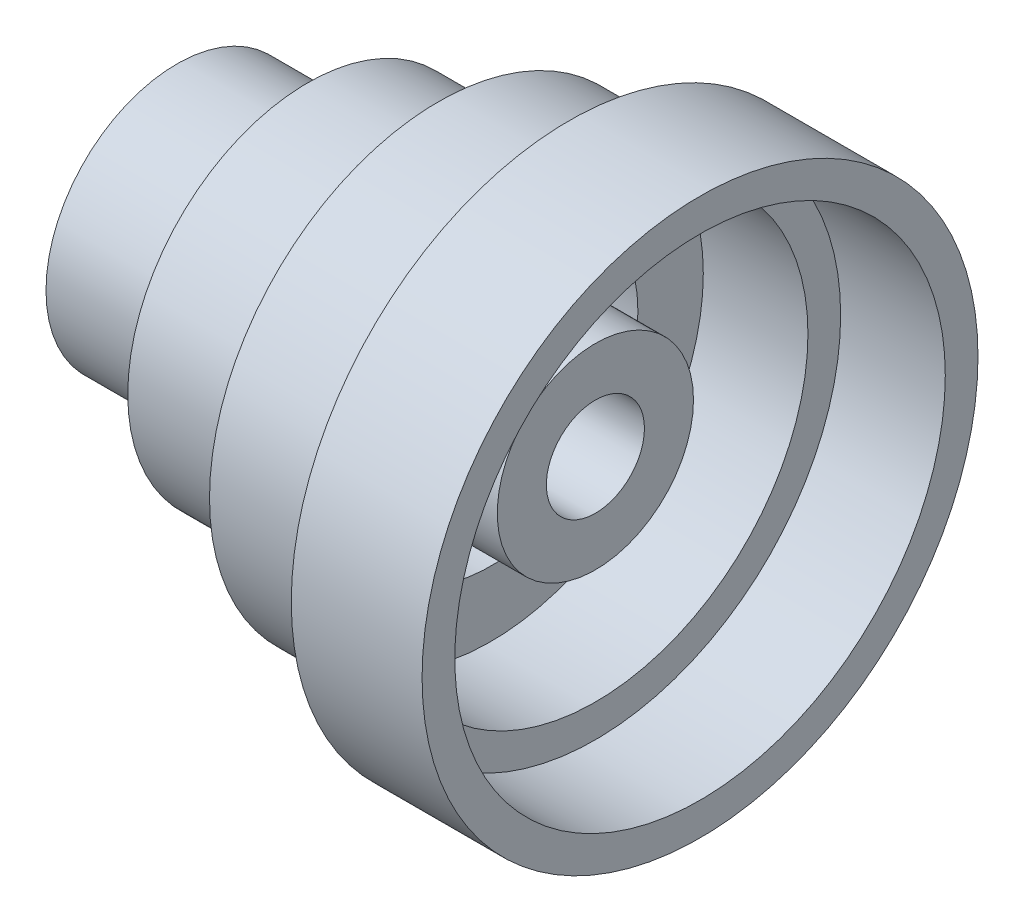
ISO-10303-21;
HEADER;
FILE_DESCRIPTION(('STEP AP214'),'2;1');
FILE_NAME('part.step','',(''),(''),'','','');
FILE_SCHEMA(('AUTOMOTIVE_DESIGN { 1 0 10303 214 1 1 1 1 }'));
ENDSEC;
DATA;
#1=APPLICATION_CONTEXT('core data for automotive mechanical design processes');
#2=APPLICATION_PROTOCOL_DEFINITION('international standard','automotive_design',2000,#1);
#3=PRODUCT_CONTEXT('',#1,'mechanical');
#4=PRODUCT('Part','Part','',(#3));
#5=PRODUCT_RELATED_PRODUCT_CATEGORY('part','',(#4));
#6=PRODUCT_DEFINITION_FORMATION('','',#4);
#7=PRODUCT_DEFINITION_CONTEXT('part definition',#1,'design');
#8=PRODUCT_DEFINITION('design','',#6,#7);
#9=PRODUCT_DEFINITION_SHAPE('','',#8);
#10=(LENGTH_UNIT() NAMED_UNIT(*) SI_UNIT(.MILLI.,.METRE.));
#11=(NAMED_UNIT(*) PLANE_ANGLE_UNIT() SI_UNIT($,.RADIAN.));
#12=(NAMED_UNIT(*) SI_UNIT($,.STERADIAN.) SOLID_ANGLE_UNIT());
#13=UNCERTAINTY_MEASURE_WITH_UNIT(LENGTH_MEASURE(1.E-05),#10,'distance_accuracy_value','');
#14=(GEOMETRIC_REPRESENTATION_CONTEXT(3) GLOBAL_UNCERTAINTY_ASSIGNED_CONTEXT((#13)) GLOBAL_UNIT_ASSIGNED_CONTEXT((#10,
#11,#12)) REPRESENTATION_CONTEXT('',''));
#15=CARTESIAN_POINT('',(0.,0.,0.));
#16=DIRECTION('',(0.,0.,1.));
#17=DIRECTION('',(1.,0.,0.));
#18=AXIS2_PLACEMENT_3D('',#15,#16,#17);
#19=CARTESIAN_POINT('',(2032.,1397.,0.));
#20=DIRECTION('',(1.,0.,0.));
#21=DIRECTION('',(0.,0.,-1.));
#22=AXIS2_PLACEMENT_3D('',#19,#20,#21);
#23=PLANE('',#22);
#24=CARTESIAN_POINT('',(2032.,0.,0.));
#25=DIRECTION('',(-1.,0.,0.));
#26=DIRECTION('',(0.,0.,1.));
#27=AXIS2_PLACEMENT_3D('',#24,#25,#26);
#28=CIRCLE('',#27,1397.);
#29=CARTESIAN_POINT('',(2032.,0.,1397.));
#30=VERTEX_POINT('',#29);
#31=EDGE_CURVE('E79',#30,#30,#28,.T.);
#32=ORIENTED_EDGE('',*,*,#31,.F.);
#33=EDGE_LOOP('',(#32));
#34=FACE_BOUND('',#33,.T.);
#35=CARTESIAN_POINT('',(2032.,0.,0.));
#36=DIRECTION('',(-1.,0.,0.));
#37=DIRECTION('',(0.,0.,1.));
#38=AXIS2_PLACEMENT_3D('',#35,#36,#37);
#39=CIRCLE('',#38,1778.);
#40=CARTESIAN_POINT('',(2032.,0.,1778.));
#41=VERTEX_POINT('',#40);
#42=EDGE_CURVE('E47',#41,#41,#39,.T.);
#43=ORIENTED_EDGE('',*,*,#42,.T.);
#44=EDGE_LOOP('',(#43));
#45=FACE_BOUND('',#44,.T.);
#46=ADVANCED_FACE('F40',(#34,#45),#23,.F.);
#47=CARTESIAN_POINT('',(0.,0.,0.));
#48=DIRECTION('',(-1.,0.,0.));
#49=DIRECTION('',(0.,0.,1.));
#50=AXIS2_PLACEMENT_3D('',#47,#48,#49);
#51=CYLINDRICAL_SURFACE('',#50,1778.);
#52=ORIENTED_EDGE('',*,*,#42,.F.);
#53=EDGE_LOOP('',(#52));
#54=FACE_BOUND('',#53,.T.);
#55=CARTESIAN_POINT('',(3048.,0.,0.));
#56=DIRECTION('',(-1.,0.,0.));
#57=DIRECTION('',(0.,0.,1.));
#58=AXIS2_PLACEMENT_3D('',#55,#56,#57);
#59=CIRCLE('',#58,1778.);
#60=CARTESIAN_POINT('',(3048.,0.,1778.));
#61=VERTEX_POINT('',#60);
#62=EDGE_CURVE('E52',#61,#61,#59,.T.);
#63=ORIENTED_EDGE('',*,*,#62,.T.);
#64=EDGE_LOOP('',(#63));
#65=FACE_BOUND('',#64,.T.);
#66=ADVANCED_FACE('F157',(#54,#65),#51,.T.);
#67=CARTESIAN_POINT('',(3048.,1778.,0.));
#68=DIRECTION('',(1.,0.,0.));
#69=DIRECTION('',(0.,0.,-1.));
#70=AXIS2_PLACEMENT_3D('',#67,#68,#69);
#71=PLANE('',#70);
#72=ORIENTED_EDGE('',*,*,#62,.F.);
#73=EDGE_LOOP('',(#72));
#74=FACE_BOUND('',#73,.T.);
#75=CARTESIAN_POINT('',(3048.,0.,0.));
#76=DIRECTION('',(-1.,0.,0.));
#77=DIRECTION('',(0.,0.,1.));
#78=AXIS2_PLACEMENT_3D('',#75,#76,#77);
#79=CIRCLE('',#78,2159.);
#80=CARTESIAN_POINT('',(3048.,0.,2159.));
#81=VERTEX_POINT('',#80);
#82=EDGE_CURVE('E57',#81,#81,#79,.T.);
#83=ORIENTED_EDGE('',*,*,#82,.T.);
#84=EDGE_LOOP('',(#83));
#85=FACE_BOUND('',#84,.T.);
#86=ADVANCED_FACE('F161',(#74,#85),#71,.F.);
#87=CARTESIAN_POINT('',(0.,0.,0.));
#88=DIRECTION('',(-1.,0.,0.));
#89=DIRECTION('',(0.,0.,1.));
#90=AXIS2_PLACEMENT_3D('',#87,#88,#89);
#91=CYLINDRICAL_SURFACE('',#90,2159.);
#92=ORIENTED_EDGE('',*,*,#82,.F.);
#93=EDGE_LOOP('',(#92));
#94=FACE_BOUND('',#93,.T.);
#95=CARTESIAN_POINT('',(4064.,0.,0.));
#96=DIRECTION('',(-1.,0.,0.));
#97=DIRECTION('',(0.,0.,1.));
#98=AXIS2_PLACEMENT_3D('',#95,#96,#97);
#99=CIRCLE('',#98,2159.);
#100=CARTESIAN_POINT('',(4064.,0.,2159.));
#101=VERTEX_POINT('',#100);
#102=EDGE_CURVE('E63',#101,#101,#99,.T.);
#103=ORIENTED_EDGE('',*,*,#102,.T.);
#104=EDGE_LOOP('',(#103));
#105=FACE_BOUND('',#104,.T.);
#106=ADVANCED_FACE('F166',(#94,#105),#91,.T.);
#107=CARTESIAN_POINT('',(4064.,2159.,0.));
#108=DIRECTION('',(-1.,0.,0.));
#109=DIRECTION('',(0.,0.,1.));
#110=AXIS2_PLACEMENT_3D('',#107,#108,#109);
#111=PLANE('',#110);
#112=CARTESIAN_POINT('',(4064.,0.,0.));
#113=DIRECTION('',(1.,0.,0.));
#114=DIRECTION('',(0.,0.,-1.));
#115=AXIS2_PLACEMENT_3D('',#112,#113,#114);
#116=CIRCLE('',#115,1905.);
#117=CARTESIAN_POINT('',(4064.,0.,-1905.));
#118=VERTEX_POINT('',#117);
#119=EDGE_CURVE('E84',#118,#118,#116,.T.);
#120=ORIENTED_EDGE('',*,*,#119,.F.);
#121=EDGE_LOOP('',(#120));
#122=FACE_BOUND('',#121,.T.);
#123=ORIENTED_EDGE('',*,*,#102,.F.);
#124=EDGE_LOOP('',(#123));
#125=FACE_BOUND('',#124,.T.);
#126=ADVANCED_FACE('F134',(#122,#125),#111,.F.);
#127=CARTESIAN_POINT('',(0.,381.,0.));
#128=DIRECTION('',(1.,0.,0.));
#129=DIRECTION('',(0.,0.,-1.));
#130=AXIS2_PLACEMENT_3D('',#127,#128,#129);
#131=PLANE('',#130);
#132=CARTESIAN_POINT('',(0.,0.,0.));
#133=DIRECTION('',(1.,0.,0.));
#134=DIRECTION('',(0.,0.,-1.));
#135=AXIS2_PLACEMENT_3D('',#132,#133,#134);
#136=CIRCLE('',#135,381.);
#137=CARTESIAN_POINT('',(0.,0.,-381.));
#138=VERTEX_POINT('',#137);
#139=EDGE_CURVE('E111',#138,#138,#136,.F.);
#140=ORIENTED_EDGE('',*,*,#139,.F.);
#141=EDGE_LOOP('',(#140));
#142=FACE_BOUND('',#141,.T.);
#143=CARTESIAN_POINT('',(0.,0.,0.));
#144=DIRECTION('',(-1.,0.,0.));
#145=DIRECTION('',(0.,0.,1.));
#146=AXIS2_PLACEMENT_3D('',#143,#144,#145);
#147=CIRCLE('',#146,1016.);
#148=CARTESIAN_POINT('',(0.,0.,1016.));
#149=VERTEX_POINT('',#148);
#150=EDGE_CURVE('E67',#149,#149,#147,.T.);
#151=ORIENTED_EDGE('',*,*,#150,.T.);
#152=EDGE_LOOP('',(#151));
#153=FACE_BOUND('',#152,.T.);
#154=ADVANCED_FACE('F130',(#142,#153),#131,.F.);
#155=CARTESIAN_POINT('',(0.,0.,0.));
#156=DIRECTION('',(-1.,0.,0.));
#157=DIRECTION('',(0.,0.,1.));
#158=AXIS2_PLACEMENT_3D('',#155,#156,#157);
#159=CYLINDRICAL_SURFACE('',#158,1016.);
#160=ORIENTED_EDGE('',*,*,#150,.F.);
#161=EDGE_LOOP('',(#160));
#162=FACE_BOUND('',#161,.T.);
#163=CARTESIAN_POINT('',(1016.,0.,0.));
#164=DIRECTION('',(-1.,0.,0.));
#165=DIRECTION('',(0.,0.,1.));
#166=AXIS2_PLACEMENT_3D('',#163,#164,#165);
#167=CIRCLE('',#166,1016.);
#168=CARTESIAN_POINT('',(1016.,0.,1016.));
#169=VERTEX_POINT('',#168);
#170=EDGE_CURVE('E71',#169,#169,#167,.T.);
#171=ORIENTED_EDGE('',*,*,#170,.T.);
#172=EDGE_LOOP('',(#171));
#173=FACE_BOUND('',#172,.T.);
#174=ADVANCED_FACE('F133',(#162,#173),#159,.T.);
#175=CARTESIAN_POINT('',(1016.,1016.,0.));
#176=DIRECTION('',(1.,0.,0.));
#177=DIRECTION('',(0.,0.,-1.));
#178=AXIS2_PLACEMENT_3D('',#175,#176,#177);
#179=PLANE('',#178);
#180=ORIENTED_EDGE('',*,*,#170,.F.);
#181=EDGE_LOOP('',(#180));
#182=FACE_BOUND('',#181,.T.);
#183=CARTESIAN_POINT('',(1016.,0.,0.));
#184=DIRECTION('',(-1.,0.,0.));
#185=DIRECTION('',(0.,0.,1.));
#186=AXIS2_PLACEMENT_3D('',#183,#184,#185);
#187=CIRCLE('',#186,1397.);
#188=CARTESIAN_POINT('',(1016.,0.,1397.));
#189=VERTEX_POINT('',#188);
#190=EDGE_CURVE('E75',#189,#189,#187,.T.);
#191=ORIENTED_EDGE('',*,*,#190,.T.);
#192=EDGE_LOOP('',(#191));
#193=FACE_BOUND('',#192,.T.);
#194=ADVANCED_FACE('F140',(#182,#193),#179,.F.);
#195=CARTESIAN_POINT('',(0.,0.,0.));
#196=DIRECTION('',(-1.,0.,0.));
#197=DIRECTION('',(0.,0.,1.));
#198=AXIS2_PLACEMENT_3D('',#195,#196,#197);
#199=CYLINDRICAL_SURFACE('',#198,1397.);
#200=ORIENTED_EDGE('',*,*,#190,.F.);
#201=EDGE_LOOP('',(#200));
#202=FACE_BOUND('',#201,.T.);
#203=ORIENTED_EDGE('',*,*,#31,.T.);
#204=EDGE_LOOP('',(#203));
#205=FACE_BOUND('',#204,.T.);
#206=ADVANCED_FACE('F146',(#202,#205),#199,.T.);
#207=CARTESIAN_POINT('',(3251.2,0.,0.));
#208=DIRECTION('',(1.,0.,0.));
#209=DIRECTION('',(0.,0.,-1.));
#210=AXIS2_PLACEMENT_3D('',#207,#208,#209);
#211=PLANE('',#210);
#212=CARTESIAN_POINT('',(3251.2,0.,0.));
#213=DIRECTION('',(1.,0.,0.));
#214=DIRECTION('',(0.,0.,-1.));
#215=AXIS2_PLACEMENT_3D('',#212,#213,#214);
#216=CIRCLE('',#215,1651.);
#217=CARTESIAN_POINT('',(3251.2,0.,-1651.));
#218=VERTEX_POINT('',#217);
#219=EDGE_CURVE('E92',#218,#218,#216,.T.);
#220=ORIENTED_EDGE('',*,*,#219,.F.);
#221=EDGE_LOOP('',(#220));
#222=FACE_BOUND('',#221,.T.);
#223=CARTESIAN_POINT('',(3251.2,0.,0.));
#224=DIRECTION('',(1.,0.,0.));
#225=DIRECTION('',(0.,0.,-1.));
#226=AXIS2_PLACEMENT_3D('',#223,#224,#225);
#227=CIRCLE('',#226,1905.);
#228=CARTESIAN_POINT('',(3251.2,0.,-1905.));
#229=VERTEX_POINT('',#228);
#230=EDGE_CURVE('E83',#229,#229,#227,.T.);
#231=ORIENTED_EDGE('',*,*,#230,.T.);
#232=EDGE_LOOP('',(#231));
#233=FACE_BOUND('',#232,.T.);
#234=ADVANCED_FACE('F152',(#222,#233),#211,.T.);
#235=CARTESIAN_POINT('',(3251.2,0.,0.));
#236=DIRECTION('',(1.,0.,0.));
#237=DIRECTION('',(0.,0.,-1.));
#238=AXIS2_PLACEMENT_3D('',#235,#236,#237);
#239=CYLINDRICAL_SURFACE('',#238,1905.);
#240=ORIENTED_EDGE('',*,*,#230,.F.);
#241=EDGE_LOOP('',(#240));
#242=FACE_BOUND('',#241,.T.);
#243=ORIENTED_EDGE('',*,*,#119,.T.);
#244=EDGE_LOOP('',(#243));
#245=FACE_BOUND('',#244,.T.);
#246=ADVANCED_FACE('F177',(#242,#245),#239,.F.);
#247=CARTESIAN_POINT('',(2438.4,0.,0.));
#248=DIRECTION('',(1.,0.,0.));
#249=DIRECTION('',(0.,0.,-1.));
#250=AXIS2_PLACEMENT_3D('',#247,#248,#249);
#251=PLANE('',#250);
#252=CARTESIAN_POINT('',(2438.4,0.,0.));
#253=DIRECTION('',(1.,0.,0.));
#254=DIRECTION('',(0.,0.,-1.));
#255=AXIS2_PLACEMENT_3D('',#252,#253,#254);
#256=CIRCLE('',#255,1143.);
#257=CARTESIAN_POINT('',(2438.4,0.,-1143.));
#258=VERTEX_POINT('',#257);
#259=EDGE_CURVE('E100',#258,#258,#256,.T.);
#260=ORIENTED_EDGE('',*,*,#259,.F.);
#261=EDGE_LOOP('',(#260));
#262=FACE_BOUND('',#261,.T.);
#263=CARTESIAN_POINT('',(2438.4,0.,0.));
#264=DIRECTION('',(1.,0.,0.));
#265=DIRECTION('',(0.,0.,-1.));
#266=AXIS2_PLACEMENT_3D('',#263,#264,#265);
#267=CIRCLE('',#266,1651.);
#268=CARTESIAN_POINT('',(2438.4,0.,-1651.));
#269=VERTEX_POINT('',#268);
#270=EDGE_CURVE('E88',#269,#269,#267,.T.);
#271=ORIENTED_EDGE('',*,*,#270,.T.);
#272=EDGE_LOOP('',(#271));
#273=FACE_BOUND('',#272,.T.);
#274=ADVANCED_FACE('F180',(#262,#273),#251,.T.);
#275=CARTESIAN_POINT('',(2438.4,0.,0.));
#276=DIRECTION('',(1.,0.,0.));
#277=DIRECTION('',(0.,0.,-1.));
#278=AXIS2_PLACEMENT_3D('',#275,#276,#277);
#279=CYLINDRICAL_SURFACE('',#278,1651.);
#280=ORIENTED_EDGE('',*,*,#270,.F.);
#281=EDGE_LOOP('',(#280));
#282=FACE_BOUND('',#281,.T.);
#283=ORIENTED_EDGE('',*,*,#219,.T.);
#284=EDGE_LOOP('',(#283));
#285=FACE_BOUND('',#284,.T.);
#286=ADVANCED_FACE('F185',(#282,#285),#279,.F.);
#287=CARTESIAN_POINT('',(1625.6,0.,0.));
#288=DIRECTION('',(1.,0.,0.));
#289=DIRECTION('',(0.,0.,-1.));
#290=AXIS2_PLACEMENT_3D('',#287,#288,#289);
#291=PLANE('',#290);
#292=CARTESIAN_POINT('',(1625.6,0.,0.));
#293=DIRECTION('',(1.,0.,0.));
#294=DIRECTION('',(0.,0.,-1.));
#295=AXIS2_PLACEMENT_3D('',#292,#293,#294);
#296=CIRCLE('',#295,762.);
#297=CARTESIAN_POINT('',(1625.6,0.,-762.));
#298=VERTEX_POINT('',#297);
#299=EDGE_CURVE('E10',#298,#298,#296,.T.);
#300=ORIENTED_EDGE('',*,*,#299,.F.);
#301=EDGE_LOOP('',(#300));
#302=FACE_BOUND('',#301,.T.);
#303=CARTESIAN_POINT('',(1625.6,0.,0.));
#304=DIRECTION('',(1.,0.,0.));
#305=DIRECTION('',(0.,0.,-1.));
#306=AXIS2_PLACEMENT_3D('',#303,#304,#305);
#307=CIRCLE('',#306,1143.);
#308=CARTESIAN_POINT('',(1625.6,0.,-1143.));
#309=VERTEX_POINT('',#308);
#310=EDGE_CURVE('E96',#309,#309,#307,.T.);
#311=ORIENTED_EDGE('',*,*,#310,.T.);
#312=EDGE_LOOP('',(#311));
#313=FACE_BOUND('',#312,.T.);
#314=ADVANCED_FACE('F188',(#302,#313),#291,.T.);
#315=CARTESIAN_POINT('',(1625.6,0.,0.));
#316=DIRECTION('',(1.,0.,0.));
#317=DIRECTION('',(0.,0.,-1.));
#318=AXIS2_PLACEMENT_3D('',#315,#316,#317);
#319=CYLINDRICAL_SURFACE('',#318,1143.);
#320=ORIENTED_EDGE('',*,*,#310,.F.);
#321=EDGE_LOOP('',(#320));
#322=FACE_BOUND('',#321,.T.);
#323=ORIENTED_EDGE('',*,*,#259,.T.);
#324=EDGE_LOOP('',(#323));
#325=FACE_BOUND('',#324,.T.);
#326=ADVANCED_FACE('F193',(#322,#325),#319,.F.);
#327=CARTESIAN_POINT('',(3251.2,0.,0.));
#328=DIRECTION('',(1.,0.,0.));
#329=DIRECTION('',(0.,0.,-1.));
#330=AXIS2_PLACEMENT_3D('',#327,#328,#329);
#331=PLANE('',#330);
#332=CARTESIAN_POINT('',(3251.2,0.,0.));
#333=DIRECTION('',(1.,0.,0.));
#334=DIRECTION('',(0.,0.,-1.));
#335=AXIS2_PLACEMENT_3D('',#332,#333,#334);
#336=CIRCLE('',#335,381.);
#337=CARTESIAN_POINT('',(3251.2,0.,-381.));
#338=VERTEX_POINT('',#337);
#339=EDGE_CURVE('E115',#338,#338,#336,.F.);
#340=ORIENTED_EDGE('',*,*,#339,.T.);
#341=EDGE_LOOP('',(#340));
#342=FACE_BOUND('',#341,.T.);
#343=CARTESIAN_POINT('',(3251.2,0.,0.));
#344=DIRECTION('',(1.,0.,0.));
#345=DIRECTION('',(0.,0.,-1.));
#346=AXIS2_PLACEMENT_3D('',#343,#344,#345);
#347=CIRCLE('',#346,762.);
#348=CARTESIAN_POINT('',(3251.2,0.,-762.));
#349=VERTEX_POINT('',#348);
#350=EDGE_CURVE('E104',#349,#349,#347,.T.);
#351=ORIENTED_EDGE('',*,*,#350,.T.);
#352=EDGE_LOOP('',(#351));
#353=FACE_BOUND('',#352,.T.);
#354=ADVANCED_FACE('F120',(#342,#353),#331,.T.);
#355=CARTESIAN_POINT('',(0.,0.,0.));
#356=DIRECTION('',(1.,0.,0.));
#357=DIRECTION('',(0.,0.,-1.));
#358=AXIS2_PLACEMENT_3D('',#355,#356,#357);
#359=CYLINDRICAL_SURFACE('',#358,762.);
#360=ORIENTED_EDGE('',*,*,#299,.T.);
#361=EDGE_LOOP('',(#360));
#362=FACE_BOUND('',#361,.T.);
#363=ORIENTED_EDGE('',*,*,#350,.F.);
#364=EDGE_LOOP('',(#363));
#365=FACE_BOUND('',#364,.T.);
#366=ADVANCED_FACE('F126',(#362,#365),#359,.T.);
#367=CARTESIAN_POINT('',(-1.2E-05,0.,0.));
#368=DIRECTION('',(1.,0.,0.));
#369=DIRECTION('',(0.,0.,-1.));
#370=AXIS2_PLACEMENT_3D('',#367,#368,#369);
#371=CYLINDRICAL_SURFACE('',#370,381.);
#372=CARTESIAN_POINT('',(3251.2,0.,-381.));
#373=CARTESIAN_POINT('',(3217.33333333333,0.,-381.));
#374=CARTESIAN_POINT('',(3183.46666666667,0.,-381.));
#375=CARTESIAN_POINT('',(3115.73333333333,0.,-381.));
#376=CARTESIAN_POINT('',(3081.86666666667,0.,-381.));
#377=CARTESIAN_POINT('',(3014.13333333333,0.,-381.));
#378=CARTESIAN_POINT('',(2980.26666666667,0.,-381.));
#379=CARTESIAN_POINT('',(2912.53333333333,0.,-381.));
#380=CARTESIAN_POINT('',(2878.66666666667,0.,-381.));
#381=CARTESIAN_POINT('',(2810.93333333333,0.,-381.));
#382=CARTESIAN_POINT('',(2777.06666666667,0.,-381.));
#383=CARTESIAN_POINT('',(2709.33333333333,0.,-381.));
#384=CARTESIAN_POINT('',(2675.46666666667,0.,-381.));
#385=CARTESIAN_POINT('',(2607.73333333333,0.,-381.));
#386=CARTESIAN_POINT('',(2573.86666666667,0.,-381.));
#387=CARTESIAN_POINT('',(2506.13333333333,0.,-381.));
#388=CARTESIAN_POINT('',(2472.26666666667,0.,-381.));
#389=CARTESIAN_POINT('',(2404.53333333333,0.,-381.));
#390=CARTESIAN_POINT('',(2370.66666666667,0.,-381.));
#391=CARTESIAN_POINT('',(2302.93333333333,0.,-381.));
#392=CARTESIAN_POINT('',(2269.06666666667,0.,-381.));
#393=CARTESIAN_POINT('',(2201.33333333333,0.,-381.));
#394=CARTESIAN_POINT('',(2167.46666666667,0.,-381.));
#395=CARTESIAN_POINT('',(2099.73333333333,0.,-381.));
#396=CARTESIAN_POINT('',(2065.86666666667,0.,-381.));
#397=CARTESIAN_POINT('',(1998.13333333333,0.,-381.));
#398=CARTESIAN_POINT('',(1964.26666666667,0.,-381.));
#399=CARTESIAN_POINT('',(1896.53333333333,0.,-381.));
#400=CARTESIAN_POINT('',(1862.66666666667,0.,-381.));
#401=CARTESIAN_POINT('',(1794.93333333333,0.,-381.));
#402=CARTESIAN_POINT('',(1761.06666666667,0.,-381.));
#403=CARTESIAN_POINT('',(1693.33333333333,0.,-381.));
#404=CARTESIAN_POINT('',(1659.46666666667,0.,-381.));
#405=CARTESIAN_POINT('',(1591.73333333333,0.,-381.));
#406=CARTESIAN_POINT('',(1557.86666666667,0.,-381.));
#407=CARTESIAN_POINT('',(1490.13333333333,0.,-381.));
#408=CARTESIAN_POINT('',(1456.26666666667,0.,-381.));
#409=CARTESIAN_POINT('',(1388.53333333333,0.,-381.));
#410=CARTESIAN_POINT('',(1354.66666666667,0.,-381.));
#411=CARTESIAN_POINT('',(1286.93333333333,0.,-381.));
#412=CARTESIAN_POINT('',(1253.06666666667,0.,-381.));
#413=CARTESIAN_POINT('',(1185.33333333333,0.,-381.));
#414=CARTESIAN_POINT('',(1151.46666666667,0.,-381.));
#415=CARTESIAN_POINT('',(1083.73333333333,0.,-381.));
#416=CARTESIAN_POINT('',(1049.86666666667,0.,-381.));
#417=CARTESIAN_POINT('',(982.133333333333,0.,-381.));
#418=CARTESIAN_POINT('',(948.266666666667,0.,-381.));
#419=CARTESIAN_POINT('',(880.533333333334,0.,-381.));
#420=CARTESIAN_POINT('',(846.666666666667,0.,-381.));
#421=CARTESIAN_POINT('',(778.933333333333,0.,-381.));
#422=CARTESIAN_POINT('',(745.066666666667,0.,-381.));
#423=CARTESIAN_POINT('',(677.333333333333,0.,-381.));
#424=CARTESIAN_POINT('',(643.466666666666,0.,-381.));
#425=CARTESIAN_POINT('',(575.733333333333,0.,-381.));
#426=CARTESIAN_POINT('',(541.866666666667,0.,-381.));
#427=CARTESIAN_POINT('',(474.133333333333,0.,-381.));
#428=CARTESIAN_POINT('',(440.266666666667,0.,-381.));
#429=CARTESIAN_POINT('',(372.533333333333,0.,-381.));
#430=CARTESIAN_POINT('',(338.666666666667,0.,-381.));
#431=CARTESIAN_POINT('',(270.933333333333,0.,-381.));
#432=CARTESIAN_POINT('',(237.066666666667,0.,-381.));
#433=CARTESIAN_POINT('',(169.333333333333,0.,-381.));
#434=CARTESIAN_POINT('',(135.466666666667,0.,-381.));
#435=CARTESIAN_POINT('',(67.7333333333334,0.,-381.));
#436=CARTESIAN_POINT('',(33.8666666666667,0.,-381.));
#437=CARTESIAN_POINT('',(1.047060307144E-13,0.,-381.));
#438=B_SPLINE_CURVE_WITH_KNOTS('',3,(#372,#373,#374,#375,#376,#377,#378,#379,#380,#381,#382,
#383,#384,#385,#386,#387,#388,#389,#390,#391,#392,#393,#394,#395,#396,#397,#398,#399,#400,#401,
#402,#403,#404,#405,#406,#407,#408,#409,#410,#411,#412,#413,#414,#415,#416,#417,#418,#419,#420,
#421,#422,#423,#424,#425,#426,#427,#428,#429,#430,#431,#432,#433,#434,#435,#436,#437),
.UNSPECIFIED.,.F.,.F.,(4,2,2,2,2,2,2,2,2,2,2,2,2,2,2,2,2,2,2,2,2,2,2,2,2,2,2,2,2,2,2,2,4),(0.,
101.6,203.2,304.8,406.4,508.,609.6,711.2,812.8,914.4,1016.,1117.6,1219.2,1320.8,1422.4,1524.,
1625.6,1727.2,1828.8,1930.4,2032.,2133.6,2235.2,2336.8,2438.4,2540.,2641.6,2743.2,2844.8,2946.4,
3048.,3149.6,3251.2),.UNSPECIFIED.);
#439=EDGE_CURVE('BSEAM123',#338,#138,#438,.T.);
#440=ORIENTED_EDGE('',*,*,#339,.F.);
#441=ORIENTED_EDGE('',*,*,#139,.T.);
#442=ORIENTED_EDGE('',*,*,#439,.T.);
#443=ORIENTED_EDGE('',*,*,#439,.F.);
#444=EDGE_LOOP('',(#440,#442,#441,#443));
#445=FACE_BOUND('',#444,.T.);
#446=ADVANCED_FACE('F123',(#445),#371,.F.);
#447=CLOSED_SHELL('',(#46,#66,#86,#106,#126,#154,#174,#194,#206,#234,#246,#274,#286,#314,#326,
#354,#366,#446));
#448=MANIFOLD_SOLID_BREP('B2',#447);
#449=ADVANCED_BREP_SHAPE_REPRESENTATION('',(#18,#448),#14);
#450=SHAPE_DEFINITION_REPRESENTATION(#9,#449);
ENDSEC;
END-ISO-10303-21;
